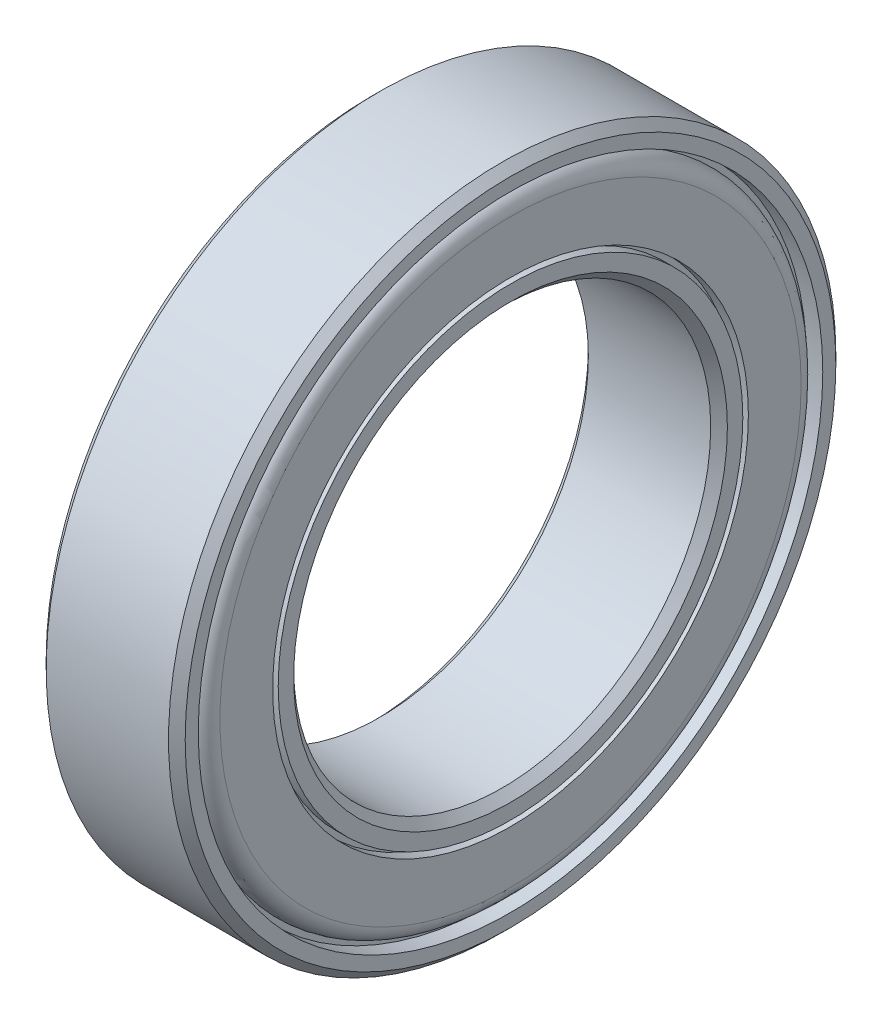
ISO-10303-21;
HEADER;
FILE_DESCRIPTION(('STEP AP214'),'2;1');
FILE_NAME('part.step','',(''),(''),'','','');
FILE_SCHEMA(('AUTOMOTIVE_DESIGN { 1 0 10303 214 1 1 1 1 }'));
ENDSEC;
DATA;
#1=APPLICATION_CONTEXT('core data for automotive mechanical design processes');
#2=APPLICATION_PROTOCOL_DEFINITION('international standard','automotive_design',2000,#1);
#3=PRODUCT_CONTEXT('',#1,'mechanical');
#4=PRODUCT('Part','Part','',(#3));
#5=PRODUCT_RELATED_PRODUCT_CATEGORY('part','',(#4));
#6=PRODUCT_DEFINITION_FORMATION('','',#4);
#7=PRODUCT_DEFINITION_CONTEXT('part definition',#1,'design');
#8=PRODUCT_DEFINITION('design','',#6,#7);
#9=PRODUCT_DEFINITION_SHAPE('','',#8);
#10=(LENGTH_UNIT() NAMED_UNIT(*) SI_UNIT(.MILLI.,.METRE.));
#11=(NAMED_UNIT(*) PLANE_ANGLE_UNIT() SI_UNIT($,.RADIAN.));
#12=(NAMED_UNIT(*) SI_UNIT($,.STERADIAN.) SOLID_ANGLE_UNIT());
#13=UNCERTAINTY_MEASURE_WITH_UNIT(LENGTH_MEASURE(1.E-05),#10,'distance_accuracy_value','');
#14=(GEOMETRIC_REPRESENTATION_CONTEXT(3) GLOBAL_UNCERTAINTY_ASSIGNED_CONTEXT((#13)) GLOBAL_UNIT_ASSIGNED_CONTEXT((#10,
#11,#12)) REPRESENTATION_CONTEXT('',''));
#15=CARTESIAN_POINT('',(0.,0.,0.));
#16=DIRECTION('',(0.,0.,1.));
#17=DIRECTION('',(1.,0.,0.));
#18=AXIS2_PLACEMENT_3D('',#15,#16,#17);
#19=CARTESIAN_POINT('',(-2.5,0.,0.));
#20=DIRECTION('',(1.,0.,0.));
#21=DIRECTION('',(0.,0.,-1.));
#22=AXIS2_PLACEMENT_3D('',#19,#20,#21);
#23=PLANE('',#22);
#24=CARTESIAN_POINT('',(-2.5,0.,0.));
#25=DIRECTION('',(1.,0.,0.));
#26=DIRECTION('',(0.,0.,-1.));
#27=AXIS2_PLACEMENT_3D('',#24,#25,#26);
#28=CIRCLE('',#27,11.7);
#29=CARTESIAN_POINT('',(-2.5,0.,-11.7));
#30=VERTEX_POINT('',#29);
#31=EDGE_CURVE('E60',#30,#30,#28,.F.);
#32=ORIENTED_EDGE('',*,*,#31,.T.);
#33=EDGE_LOOP('',(#32));
#34=FACE_BOUND('',#33,.T.);
#35=CARTESIAN_POINT('',(-2.5,0.,0.));
#36=DIRECTION('',(1.,0.,0.));
#37=DIRECTION('',(0.,0.,-1.));
#38=AXIS2_PLACEMENT_3D('',#35,#36,#37);
#39=CIRCLE('',#38,11.2300842863391);
#40=CARTESIAN_POINT('',(-2.5,0.,-11.2300842863391));
#41=VERTEX_POINT('',#40);
#42=EDGE_CURVE('E41',#41,#41,#39,.T.);
#43=ORIENTED_EDGE('',*,*,#42,.T.);
#44=EDGE_LOOP('',(#43));
#45=FACE_BOUND('',#44,.T.);
#46=ADVANCED_FACE('F36',(#34,#45),#23,.F.);
#47=CARTESIAN_POINT('',(-2.5,0.,0.));
#48=DIRECTION('',(1.,0.,0.));
#49=DIRECTION('',(0.,0.,-1.));
#50=AXIS2_PLACEMENT_3D('',#47,#48,#49);
#51=CIRCLE('',#50,7.8);
#52=CARTESIAN_POINT('',(-2.5,0.,-7.8));
#53=VERTEX_POINT('',#52);
#54=EDGE_CURVE('E96',#53,#53,#51,.T.);
#55=ORIENTED_EDGE('',*,*,#54,.T.);
#56=EDGE_LOOP('',(#55));
#57=FACE_BOUND('',#56,.T.);
#58=CARTESIAN_POINT('',(-2.5,0.,0.));
#59=DIRECTION('',(1.,0.,0.));
#60=DIRECTION('',(0.,0.,-1.));
#61=AXIS2_PLACEMENT_3D('',#58,#59,#60);
#62=CIRCLE('',#61,8.3545480158089);
#63=CARTESIAN_POINT('',(-2.5,0.,-8.3545480158089));
#64=VERTEX_POINT('',#63);
#65=EDGE_CURVE('E61',#64,#64,#62,.F.);
#66=ORIENTED_EDGE('',*,*,#65,.T.);
#67=EDGE_LOOP('',(#66));
#68=FACE_BOUND('',#67,.T.);
#69=ADVANCED_FACE('F136',(#57,#68),#23,.F.);
#70=CARTESIAN_POINT('',(2.5,0.,0.));
#71=DIRECTION('',(1.,0.,0.));
#72=DIRECTION('',(0.,0.,-1.));
#73=AXIS2_PLACEMENT_3D('',#70,#71,#72);
#74=PLANE('',#73);
#75=CARTESIAN_POINT('',(2.5,0.,0.));
#76=DIRECTION('',(1.,0.,0.));
#77=DIRECTION('',(0.,0.,-1.));
#78=AXIS2_PLACEMENT_3D('',#75,#76,#77);
#79=CIRCLE('',#78,11.7);
#80=CARTESIAN_POINT('',(2.5,0.,-11.7));
#81=VERTEX_POINT('',#80);
#82=EDGE_CURVE('E105',#81,#81,#79,.T.);
#83=ORIENTED_EDGE('',*,*,#82,.T.);
#84=EDGE_LOOP('',(#83));
#85=FACE_BOUND('',#84,.T.);
#86=CARTESIAN_POINT('',(2.5,0.,0.));
#87=DIRECTION('',(1.,0.,0.));
#88=DIRECTION('',(0.,0.,-1.));
#89=AXIS2_PLACEMENT_3D('',#86,#87,#88);
#90=CIRCLE('',#89,11.2300842863391);
#91=CARTESIAN_POINT('',(2.5,0.,-11.2300842863391));
#92=VERTEX_POINT('',#91);
#93=EDGE_CURVE('E57',#92,#92,#90,.T.);
#94=ORIENTED_EDGE('',*,*,#93,.F.);
#95=EDGE_LOOP('',(#94));
#96=FACE_BOUND('',#95,.T.);
#97=ADVANCED_FACE('F143',(#85,#96),#74,.T.);
#98=CARTESIAN_POINT('',(2.5,0.,0.));
#99=DIRECTION('',(1.,0.,0.));
#100=DIRECTION('',(0.,0.,-1.));
#101=AXIS2_PLACEMENT_3D('',#98,#99,#100);
#102=CIRCLE('',#101,7.79999999999999);
#103=CARTESIAN_POINT('',(2.5,0.,-7.79999999999999));
#104=VERTEX_POINT('',#103);
#105=EDGE_CURVE('E50',#104,#104,#102,.F.);
#106=ORIENTED_EDGE('',*,*,#105,.T.);
#107=EDGE_LOOP('',(#106));
#108=FACE_BOUND('',#107,.T.);
#109=CARTESIAN_POINT('',(2.5,0.,0.));
#110=DIRECTION('',(1.,0.,0.));
#111=DIRECTION('',(0.,0.,-1.));
#112=AXIS2_PLACEMENT_3D('',#109,#110,#111);
#113=CIRCLE('',#112,8.3545480158089);
#114=CARTESIAN_POINT('',(2.5,0.,-8.3545480158089));
#115=VERTEX_POINT('',#114);
#116=EDGE_CURVE('E54',#115,#115,#113,.F.);
#117=ORIENTED_EDGE('',*,*,#116,.F.);
#118=EDGE_LOOP('',(#117));
#119=FACE_BOUND('',#118,.T.);
#120=ADVANCED_FACE('F110',(#108,#119),#74,.T.);
#121=CARTESIAN_POINT('',(2.5,0.,0.));
#122=DIRECTION('',(-1.,0.,0.));
#123=DIRECTION('',(0.,0.,1.));
#124=AXIS2_PLACEMENT_3D('',#121,#122,#123);
#125=CYLINDRICAL_SURFACE('',#124,12.);
#126=CARTESIAN_POINT('',(-2.2,0.,0.));
#127=DIRECTION('',(1.,0.,0.));
#128=DIRECTION('',(0.,0.,-1.));
#129=AXIS2_PLACEMENT_3D('',#126,#127,#128);
#130=CIRCLE('',#129,12.);
#131=CARTESIAN_POINT('',(-2.2,0.,-12.));
#132=VERTEX_POINT('',#131);
#133=EDGE_CURVE('E10',#132,#132,#130,.T.);
#134=ORIENTED_EDGE('',*,*,#133,.T.);
#135=EDGE_LOOP('',(#134));
#136=FACE_BOUND('',#135,.T.);
#137=CARTESIAN_POINT('',(2.20000000000001,0.,0.));
#138=DIRECTION('',(1.,0.,0.));
#139=DIRECTION('',(0.,0.,-1.));
#140=AXIS2_PLACEMENT_3D('',#137,#138,#139);
#141=CIRCLE('',#140,12.);
#142=CARTESIAN_POINT('',(2.20000000000001,0.,-12.));
#143=VERTEX_POINT('',#142);
#144=EDGE_CURVE('E45',#143,#143,#141,.F.);
#145=ORIENTED_EDGE('',*,*,#144,.T.);
#146=EDGE_LOOP('',(#145));
#147=FACE_BOUND('',#146,.T.);
#148=ADVANCED_FACE('F123',(#136,#147),#125,.T.);
#149=CARTESIAN_POINT('',(2.5,0.,0.));
#150=DIRECTION('',(-1.,0.,0.));
#151=DIRECTION('',(0.,0.,1.));
#152=AXIS2_PLACEMENT_3D('',#149,#150,#151);
#153=CYLINDRICAL_SURFACE('',#152,7.5);
#154=CARTESIAN_POINT('',(-2.2,0.,0.));
#155=DIRECTION('',(1.,0.,0.));
#156=DIRECTION('',(0.,0.,-1.));
#157=AXIS2_PLACEMENT_3D('',#154,#155,#156);
#158=CIRCLE('',#157,7.5);
#159=CARTESIAN_POINT('',(-2.2,0.,-7.5));
#160=VERTEX_POINT('',#159);
#161=EDGE_CURVE('E102',#160,#160,#158,.F.);
#162=ORIENTED_EDGE('',*,*,#161,.T.);
#163=EDGE_LOOP('',(#162));
#164=FACE_BOUND('',#163,.T.);
#165=CARTESIAN_POINT('',(2.20000000000001,0.,0.));
#166=DIRECTION('',(1.,0.,0.));
#167=DIRECTION('',(0.,0.,-1.));
#168=AXIS2_PLACEMENT_3D('',#165,#166,#167);
#169=CIRCLE('',#168,7.5);
#170=CARTESIAN_POINT('',(2.20000000000001,0.,-7.5));
#171=VERTEX_POINT('',#170);
#172=EDGE_CURVE('E99',#171,#171,#169,.T.);
#173=ORIENTED_EDGE('',*,*,#172,.T.);
#174=EDGE_LOOP('',(#173));
#175=FACE_BOUND('',#174,.T.);
#176=ADVANCED_FACE('F121',(#164,#175),#153,.F.);
#177=CARTESIAN_POINT('',(-2.5,0.,0.));
#178=DIRECTION('',(-1.,0.,0.));
#179=DIRECTION('',(0.,0.,1.));
#180=AXIS2_PLACEMENT_3D('',#177,#178,#179);
#181=CONICAL_SURFACE('',#180,7.8,0.785398163397447);
#182=ORIENTED_EDGE('',*,*,#161,.F.);
#183=EDGE_LOOP('',(#182));
#184=FACE_BOUND('',#183,.T.);
#185=ORIENTED_EDGE('',*,*,#54,.F.);
#186=EDGE_LOOP('',(#185));
#187=FACE_BOUND('',#186,.T.);
#188=ADVANCED_FACE('F117',(#184,#187),#181,.F.);
#189=CARTESIAN_POINT('',(2.20000000000001,0.,0.));
#190=DIRECTION('',(1.,0.,0.));
#191=DIRECTION('',(0.,0.,-1.));
#192=AXIS2_PLACEMENT_3D('',#189,#190,#191);
#193=CONICAL_SURFACE('',#192,7.5,0.785398163397444);
#194=ORIENTED_EDGE('',*,*,#105,.F.);
#195=EDGE_LOOP('',(#194));
#196=FACE_BOUND('',#195,.T.);
#197=ORIENTED_EDGE('',*,*,#172,.F.);
#198=EDGE_LOOP('',(#197));
#199=FACE_BOUND('',#198,.T.);
#200=ADVANCED_FACE('F113',(#196,#199),#193,.F.);
#201=CARTESIAN_POINT('',(-2.2,0.,0.));
#202=DIRECTION('',(1.,0.,0.));
#203=DIRECTION('',(0.,0.,-1.));
#204=AXIS2_PLACEMENT_3D('',#201,#202,#203);
#205=CONICAL_SURFACE('',#204,12.,0.785398163397445);
#206=ORIENTED_EDGE('',*,*,#31,.F.);
#207=EDGE_LOOP('',(#206));
#208=FACE_BOUND('',#207,.T.);
#209=ORIENTED_EDGE('',*,*,#133,.F.);
#210=EDGE_LOOP('',(#209));
#211=FACE_BOUND('',#210,.T.);
#212=ADVANCED_FACE('F116',(#208,#211),#205,.T.);
#213=CARTESIAN_POINT('',(2.5,0.,0.));
#214=DIRECTION('',(-1.,0.,0.));
#215=DIRECTION('',(0.,0.,1.));
#216=AXIS2_PLACEMENT_3D('',#213,#214,#215);
#217=CONICAL_SURFACE('',#216,11.7,0.78539816339744);
#218=ORIENTED_EDGE('',*,*,#144,.F.);
#219=EDGE_LOOP('',(#218));
#220=FACE_BOUND('',#219,.T.);
#221=ORIENTED_EDGE('',*,*,#82,.F.);
#222=EDGE_LOOP('',(#221));
#223=FACE_BOUND('',#222,.T.);
#224=ADVANCED_FACE('F39',(#220,#223),#217,.T.);
#225=CARTESIAN_POINT('',(3.21171908312557,0.,0.));
#226=DIRECTION('',(1.,0.,0.));
#227=DIRECTION('',(0.,0.,-1.));
#228=AXIS2_PLACEMENT_3D('',#225,#226,#227);
#229=CYLINDRICAL_SURFACE('',#228,8.5545480158089);
#230=CARTESIAN_POINT('',(2.08484867740035,0.,0.));
#231=DIRECTION('',(1.,0.,0.));
#232=DIRECTION('',(0.,0.,-1.));
#233=AXIS2_PLACEMENT_3D('',#230,#231,#232);
#234=CIRCLE('',#233,8.5545480158089);
#235=CARTESIAN_POINT('',(2.08484867740035,0.,-8.5545480158089));
#236=VERTEX_POINT('',#235);
#237=EDGE_CURVE('E80',#236,#236,#234,.T.);
#238=ORIENTED_EDGE('',*,*,#237,.F.);
#239=EDGE_LOOP('',(#238));
#240=FACE_BOUND('',#239,.T.);
#241=CARTESIAN_POINT('',(2.5,0.,0.));
#242=DIRECTION('',(1.,0.,0.));
#243=DIRECTION('',(0.,0.,-1.));
#244=AXIS2_PLACEMENT_3D('',#241,#242,#243);
#245=CIRCLE('',#244,8.5545480158089);
#246=CARTESIAN_POINT('',(2.5,0.,-8.5545480158089));
#247=VERTEX_POINT('',#246);
#248=EDGE_CURVE('E83',#247,#247,#245,.T.);
#249=ORIENTED_EDGE('',*,*,#248,.T.);
#250=EDGE_LOOP('',(#249));
#251=FACE_BOUND('',#250,.T.);
#252=ADVANCED_FACE('F207',(#240,#251),#229,.F.);
#253=CARTESIAN_POINT('',(2.08484867740035,8.5545480158089,0.));
#254=DIRECTION('',(-1.,0.,0.));
#255=DIRECTION('',(0.,0.,1.));
#256=AXIS2_PLACEMENT_3D('',#253,#254,#255);
#257=PLANE('',#256);
#258=CARTESIAN_POINT('',(2.08484867740035,0.,0.));
#259=DIRECTION('',(1.,0.,0.));
#260=DIRECTION('',(0.,0.,-1.));
#261=AXIS2_PLACEMENT_3D('',#258,#259,#260);
#262=CIRCLE('',#261,8.3545480158089);
#263=CARTESIAN_POINT('',(2.08484867740035,0.,-8.3545480158089));
#264=VERTEX_POINT('',#263);
#265=EDGE_CURVE('E67',#264,#264,#262,.T.);
#266=ORIENTED_EDGE('',*,*,#265,.F.);
#267=EDGE_LOOP('',(#266));
#268=FACE_BOUND('',#267,.T.);
#269=ORIENTED_EDGE('',*,*,#237,.T.);
#270=EDGE_LOOP('',(#269));
#271=FACE_BOUND('',#270,.T.);
#272=ADVANCED_FACE('F203',(#268,#271),#257,.F.);
#273=CARTESIAN_POINT('',(3.21171908312557,0.,0.));
#274=DIRECTION('',(1.,0.,0.));
#275=DIRECTION('',(0.,0.,-1.));
#276=AXIS2_PLACEMENT_3D('',#273,#274,#275);
#277=CYLINDRICAL_SURFACE('',#276,8.3545480158089);
#278=ORIENTED_EDGE('',*,*,#116,.T.);
#279=EDGE_LOOP('',(#278));
#280=FACE_BOUND('',#279,.T.);
#281=ORIENTED_EDGE('',*,*,#265,.T.);
#282=EDGE_LOOP('',(#281));
#283=FACE_BOUND('',#282,.T.);
#284=ADVANCED_FACE('F199',(#280,#283),#277,.T.);
#285=ORIENTED_EDGE('',*,*,#248,.F.);
#286=EDGE_LOOP('',(#285));
#287=FACE_BOUND('',#286,.T.);
#288=CARTESIAN_POINT('',(2.5,0.,0.));
#289=DIRECTION('',(1.,0.,0.));
#290=DIRECTION('',(0.,0.,-1.));
#291=AXIS2_PLACEMENT_3D('',#288,#289,#290);
#292=CIRCLE('',#291,10.4508504768167);
#293=CARTESIAN_POINT('',(2.5,0.,-10.4508504768167));
#294=VERTEX_POINT('',#293);
#295=EDGE_CURVE('E86',#294,#294,#292,.T.);
#296=ORIENTED_EDGE('',*,*,#295,.T.);
#297=EDGE_LOOP('',(#296));
#298=FACE_BOUND('',#297,.T.);
#299=ADVANCED_FACE('F202',(#287,#298),#74,.T.);
#300=CARTESIAN_POINT('',(3.21171908312557,0.,0.));
#301=DIRECTION('',(1.,0.,0.));
#302=DIRECTION('',(0.,0.,-1.));
#303=AXIS2_PLACEMENT_3D('',#300,#301,#302);
#304=CYLINDRICAL_SURFACE('',#303,11.2300842863391);
#305=ORIENTED_EDGE('',*,*,#93,.T.);
#306=EDGE_LOOP('',(#305));
#307=FACE_BOUND('',#306,.T.);
#308=CARTESIAN_POINT('',(1.92076619047756,0.,0.));
#309=DIRECTION('',(1.,0.,0.));
#310=DIRECTION('',(0.,0.,-1.));
#311=AXIS2_PLACEMENT_3D('',#308,#309,#310);
#312=CIRCLE('',#311,11.2300842863391);
#313=CARTESIAN_POINT('',(1.92076619047756,0.,-11.2300842863391));
#314=VERTEX_POINT('',#313);
#315=EDGE_CURVE('E58',#314,#314,#312,.T.);
#316=ORIENTED_EDGE('',*,*,#315,.F.);
#317=EDGE_LOOP('',(#316));
#318=FACE_BOUND('',#317,.T.);
#319=ADVANCED_FACE('F213',(#307,#318),#304,.F.);
#320=CARTESIAN_POINT('',(1.92076619047756,11.2300842863391,0.));
#321=DIRECTION('',(-1.,0.,0.));
#322=DIRECTION('',(0.,0.,1.));
#323=AXIS2_PLACEMENT_3D('',#320,#321,#322);
#324=PLANE('',#323);
#325=CARTESIAN_POINT('',(1.92076619047756,0.,0.));
#326=DIRECTION('',(1.,0.,0.));
#327=DIRECTION('',(0.,0.,-1.));
#328=AXIS2_PLACEMENT_3D('',#325,#326,#327);
#329=CIRCLE('',#328,11.0300842863391);
#330=CARTESIAN_POINT('',(1.92076619047756,0.,-11.0300842863391));
#331=VERTEX_POINT('',#330);
#332=EDGE_CURVE('E89',#331,#331,#329,.T.);
#333=ORIENTED_EDGE('',*,*,#332,.F.);
#334=EDGE_LOOP('',(#333));
#335=FACE_BOUND('',#334,.T.);
#336=ORIENTED_EDGE('',*,*,#315,.T.);
#337=EDGE_LOOP('',(#336));
#338=FACE_BOUND('',#337,.T.);
#339=ADVANCED_FACE('F188',(#335,#338),#324,.F.);
#340=CARTESIAN_POINT('',(1.92076619047756,0.,0.));
#341=DIRECTION('',(1.,0.,0.));
#342=DIRECTION('',(0.,0.,-1.));
#343=AXIS2_PLACEMENT_3D('',#340,#341,#342);
#344=TOROIDAL_SURFACE('',#343,10.4508504768167,0.579233809522436);
#345=ORIENTED_EDGE('',*,*,#295,.F.);
#346=EDGE_LOOP('',(#345));
#347=FACE_BOUND('',#346,.T.);
#348=ORIENTED_EDGE('',*,*,#332,.T.);
#349=EDGE_LOOP('',(#348));
#350=FACE_BOUND('',#349,.T.);
#351=ADVANCED_FACE('F183',(#347,#350),#344,.T.);
#352=CARTESIAN_POINT('',(-3.21171908312557,0.,0.));
#353=DIRECTION('',(-1.,0.,0.));
#354=DIRECTION('',(0.,0.,-1.));
#355=AXIS2_PLACEMENT_3D('',#352,#353,#354);
#356=CYLINDRICAL_SURFACE('',#355,8.5545480158089);
#357=CARTESIAN_POINT('',(-2.08484867740035,0.,0.));
#358=DIRECTION('',(1.,0.,0.));
#359=DIRECTION('',(0.,0.,-1.));
#360=AXIS2_PLACEMENT_3D('',#357,#358,#359);
#361=CIRCLE('',#360,8.5545480158089);
#362=CARTESIAN_POINT('',(-2.08484867740035,0.,-8.5545480158089));
#363=VERTEX_POINT('',#362);
#364=EDGE_CURVE('E166',#363,#363,#361,.T.);
#365=ORIENTED_EDGE('',*,*,#364,.T.);
#366=EDGE_LOOP('',(#365));
#367=FACE_BOUND('',#366,.T.);
#368=CARTESIAN_POINT('',(-2.5,0.,0.));
#369=DIRECTION('',(1.,0.,0.));
#370=DIRECTION('',(0.,0.,-1.));
#371=AXIS2_PLACEMENT_3D('',#368,#369,#370);
#372=CIRCLE('',#371,8.5545480158089);
#373=CARTESIAN_POINT('',(-2.5,0.,-8.5545480158089));
#374=VERTEX_POINT('',#373);
#375=EDGE_CURVE('E164',#374,#374,#372,.T.);
#376=ORIENTED_EDGE('',*,*,#375,.F.);
#377=EDGE_LOOP('',(#376));
#378=FACE_BOUND('',#377,.T.);
#379=ADVANCED_FACE('F178',(#367,#378),#356,.F.);
#380=CARTESIAN_POINT('',(-2.08484867740035,8.5545480158089,0.));
#381=DIRECTION('',(1.,0.,0.));
#382=DIRECTION('',(0.,0.,1.));
#383=AXIS2_PLACEMENT_3D('',#380,#381,#382);
#384=PLANE('',#383);
#385=CARTESIAN_POINT('',(-2.08484867740035,0.,0.));
#386=DIRECTION('',(1.,0.,0.));
#387=DIRECTION('',(0.,0.,-1.));
#388=AXIS2_PLACEMENT_3D('',#385,#386,#387);
#389=CIRCLE('',#388,8.3545480158089);
#390=CARTESIAN_POINT('',(-2.08484867740035,0.,-8.3545480158089));
#391=VERTEX_POINT('',#390);
#392=EDGE_CURVE('E169',#391,#391,#389,.T.);
#393=ORIENTED_EDGE('',*,*,#392,.T.);
#394=EDGE_LOOP('',(#393));
#395=FACE_BOUND('',#394,.T.);
#396=ORIENTED_EDGE('',*,*,#364,.F.);
#397=EDGE_LOOP('',(#396));
#398=FACE_BOUND('',#397,.T.);
#399=ADVANCED_FACE('F156',(#395,#398),#384,.F.);
#400=CARTESIAN_POINT('',(-3.21171908312557,0.,0.));
#401=DIRECTION('',(-1.,0.,0.));
#402=DIRECTION('',(0.,0.,-1.));
#403=AXIS2_PLACEMENT_3D('',#400,#401,#402);
#404=CYLINDRICAL_SURFACE('',#403,8.3545480158089);
#405=ORIENTED_EDGE('',*,*,#392,.F.);
#406=EDGE_LOOP('',(#405));
#407=FACE_BOUND('',#406,.T.);
#408=ORIENTED_EDGE('',*,*,#65,.F.);
#409=EDGE_LOOP('',(#408));
#410=FACE_BOUND('',#409,.T.);
#411=ADVANCED_FACE('F148',(#407,#410),#404,.T.);
#412=CARTESIAN_POINT('',(-2.5,0.,0.));
#413=DIRECTION('',(1.,0.,0.));
#414=DIRECTION('',(0.,0.,-1.));
#415=AXIS2_PLACEMENT_3D('',#412,#413,#414);
#416=CIRCLE('',#415,10.4508504768167);
#417=CARTESIAN_POINT('',(-2.5,0.,-10.4508504768167));
#418=VERTEX_POINT('',#417);
#419=EDGE_CURVE('E74',#418,#418,#416,.T.);
#420=ORIENTED_EDGE('',*,*,#419,.F.);
#421=EDGE_LOOP('',(#420));
#422=FACE_BOUND('',#421,.T.);
#423=ORIENTED_EDGE('',*,*,#375,.T.);
#424=EDGE_LOOP('',(#423));
#425=FACE_BOUND('',#424,.T.);
#426=ADVANCED_FACE('F139',(#422,#425),#23,.F.);
#427=CARTESIAN_POINT('',(-3.21171908312557,0.,0.));
#428=DIRECTION('',(-1.,0.,0.));
#429=DIRECTION('',(0.,0.,-1.));
#430=AXIS2_PLACEMENT_3D('',#427,#428,#429);
#431=CYLINDRICAL_SURFACE('',#430,11.2300842863391);
#432=CARTESIAN_POINT('',(-1.92076619047756,0.,0.));
#433=DIRECTION('',(1.,0.,0.));
#434=DIRECTION('',(0.,0.,-1.));
#435=AXIS2_PLACEMENT_3D('',#432,#433,#434);
#436=CIRCLE('',#435,11.2300842863391);
#437=CARTESIAN_POINT('',(-1.92076619047756,0.,-11.2300842863391));
#438=VERTEX_POINT('',#437);
#439=EDGE_CURVE('E63',#438,#438,#436,.T.);
#440=ORIENTED_EDGE('',*,*,#439,.T.);
#441=EDGE_LOOP('',(#440));
#442=FACE_BOUND('',#441,.T.);
#443=ORIENTED_EDGE('',*,*,#42,.F.);
#444=EDGE_LOOP('',(#443));
#445=FACE_BOUND('',#444,.T.);
#446=ADVANCED_FACE('F147',(#442,#445),#431,.F.);
#447=CARTESIAN_POINT('',(-1.92076619047756,11.2300842863391,0.));
#448=DIRECTION('',(1.,0.,0.));
#449=DIRECTION('',(0.,0.,1.));
#450=AXIS2_PLACEMENT_3D('',#447,#448,#449);
#451=PLANE('',#450);
#452=CARTESIAN_POINT('',(-1.92076619047756,0.,0.));
#453=DIRECTION('',(1.,0.,0.));
#454=DIRECTION('',(0.,0.,-1.));
#455=AXIS2_PLACEMENT_3D('',#452,#453,#454);
#456=CIRCLE('',#455,11.0300842863391);
#457=CARTESIAN_POINT('',(-1.92076619047756,0.,-11.0300842863391));
#458=VERTEX_POINT('',#457);
#459=EDGE_CURVE('E69',#458,#458,#456,.T.);
#460=ORIENTED_EDGE('',*,*,#459,.T.);
#461=EDGE_LOOP('',(#460));
#462=FACE_BOUND('',#461,.T.);
#463=ORIENTED_EDGE('',*,*,#439,.F.);
#464=EDGE_LOOP('',(#463));
#465=FACE_BOUND('',#464,.T.);
#466=ADVANCED_FACE('F154',(#462,#465),#451,.F.);
#467=CARTESIAN_POINT('',(-1.92076619047756,0.,0.));
#468=DIRECTION('',(-1.,0.,0.));
#469=DIRECTION('',(0.,0.,-1.));
#470=AXIS2_PLACEMENT_3D('',#467,#468,#469);
#471=TOROIDAL_SURFACE('',#470,10.4508504768167,0.579233809522436);
#472=ORIENTED_EDGE('',*,*,#419,.T.);
#473=EDGE_LOOP('',(#472));
#474=FACE_BOUND('',#473,.T.);
#475=ORIENTED_EDGE('',*,*,#459,.F.);
#476=EDGE_LOOP('',(#475));
#477=FACE_BOUND('',#476,.T.);
#478=ADVANCED_FACE('F192',(#474,#477),#471,.T.);
#479=CLOSED_SHELL('',(#46,#69,#97,#120,#148,#176,#188,#200,#212,#224,#252,#272,#284,#299,#319,
#339,#351,#379,#399,#411,#426,#446,#466,#478));
#480=MANIFOLD_SOLID_BREP('B2',#479);
#481=ADVANCED_BREP_SHAPE_REPRESENTATION('',(#18,#480),#14);
#482=SHAPE_DEFINITION_REPRESENTATION(#9,#481);
ENDSEC;
END-ISO-10303-21;
